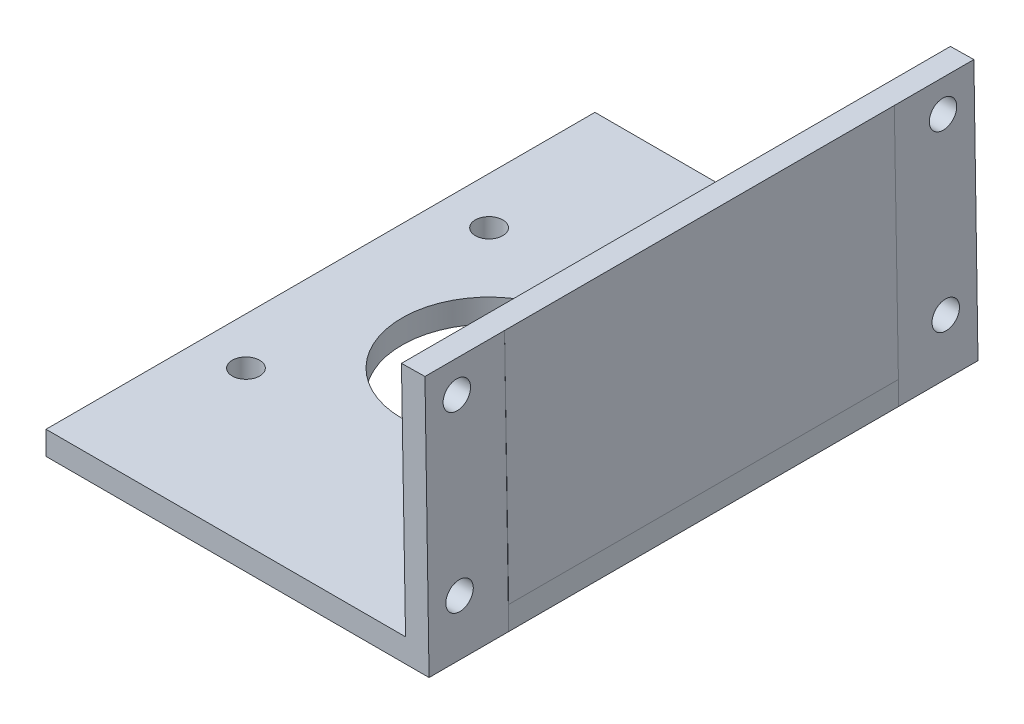
ISO-10303-21;
HEADER;
FILE_DESCRIPTION(('STEP AP214'),'2;1');
FILE_NAME('part.step','',(''),(''),'','','');
FILE_SCHEMA(('AUTOMOTIVE_DESIGN { 1 0 10303 214 1 1 1 1 }'));
ENDSEC;
DATA;
#1=APPLICATION_CONTEXT('core data for automotive mechanical design processes');
#2=APPLICATION_PROTOCOL_DEFINITION('international standard','automotive_design',2000,#1);
#3=PRODUCT_CONTEXT('',#1,'mechanical');
#4=PRODUCT('Part','Part','',(#3));
#5=PRODUCT_RELATED_PRODUCT_CATEGORY('part','',(#4));
#6=PRODUCT_DEFINITION_FORMATION('','',#4);
#7=PRODUCT_DEFINITION_CONTEXT('part definition',#1,'design');
#8=PRODUCT_DEFINITION('design','',#6,#7);
#9=PRODUCT_DEFINITION_SHAPE('','',#8);
#10=(LENGTH_UNIT() NAMED_UNIT(*) SI_UNIT(.MILLI.,.METRE.));
#11=(NAMED_UNIT(*) PLANE_ANGLE_UNIT() SI_UNIT($,.RADIAN.));
#12=(NAMED_UNIT(*) SI_UNIT($,.STERADIAN.) SOLID_ANGLE_UNIT());
#13=UNCERTAINTY_MEASURE_WITH_UNIT(LENGTH_MEASURE(1.E-05),#10,'distance_accuracy_value','');
#14=(GEOMETRIC_REPRESENTATION_CONTEXT(3) GLOBAL_UNCERTAINTY_ASSIGNED_CONTEXT((#13)) GLOBAL_UNIT_ASSIGNED_CONTEXT((#10,
#11,#12)) REPRESENTATION_CONTEXT('',''));
#15=CARTESIAN_POINT('',(0.,0.,0.));
#16=DIRECTION('',(0.,0.,1.));
#17=DIRECTION('',(1.,0.,0.));
#18=AXIS2_PLACEMENT_3D('',#15,#16,#17);
#19=CARTESIAN_POINT('',(0.,3.,0.));
#20=DIRECTION('',(0.,-1.,0.));
#21=DIRECTION('',(0.,0.,-1.));
#22=AXIS2_PLACEMENT_3D('',#19,#20,#21);
#23=PLANE('',#22);
#24=CARTESIAN_POINT('',(21.5,3.,-24.85));
#25=DIRECTION('',(0.,1.,0.));
#26=DIRECTION('',(0.,0.,1.));
#27=AXIS2_PLACEMENT_3D('',#24,#25,#26);
#28=CIRCLE('',#27,11.1);
#29=CARTESIAN_POINT('',(21.5,3.,-13.75));
#30=VERTEX_POINT('',#29);
#31=EDGE_CURVE('E289',#30,#30,#28,.T.);
#32=ORIENTED_EDGE('',*,*,#31,.F.);
#33=EDGE_LOOP('',(#32));
#34=FACE_BOUND('',#33,.T.);
#35=DIRECTION('',(0.,0.,1.));
#36=VECTOR('',#35,1.);
#37=CARTESIAN_POINT('',(0.,3.,0.));
#38=LINE('',#37,#36);
#39=CARTESIAN_POINT('',(0.,3.,-59.85));
#40=VERTEX_POINT('',#39);
#41=CARTESIAN_POINT('',(0.,3.,10.15));
#42=VERTEX_POINT('',#41);
#43=EDGE_CURVE('E120',#40,#42,#38,.T.);
#44=ORIENTED_EDGE('',*,*,#43,.T.);
#45=DIRECTION('',(-1.,0.,0.));
#46=VECTOR('',#45,1.);
#47=CARTESIAN_POINT('',(0.,3.,10.15));
#48=LINE('',#47,#46);
#49=CARTESIAN_POINT('',(45.8495430158683,3.,10.15));
#50=VERTEX_POINT('',#49);
#51=EDGE_CURVE('E188',#50,#42,#48,.T.);
#52=ORIENTED_EDGE('',*,*,#51,.F.);
#53=DIRECTION('',(0.,0.,-1.));
#54=VECTOR('',#53,1.);
#55=CARTESIAN_POINT('',(45.8495430158683,3.,0.));
#56=LINE('',#55,#54);
#57=CARTESIAN_POINT('',(45.8495430158683,3.,-59.85));
#58=VERTEX_POINT('',#57);
#59=EDGE_CURVE('E146',#50,#58,#56,.T.);
#60=ORIENTED_EDGE('',*,*,#59,.T.);
#61=DIRECTION('',(-1.,0.,0.));
#62=VECTOR('',#61,1.);
#63=CARTESIAN_POINT('',(45.8495430158683,3.,-59.85));
#64=LINE('',#63,#62);
#65=EDGE_CURVE('E138',#58,#40,#64,.T.);
#66=ORIENTED_EDGE('',*,*,#65,.T.);
#67=EDGE_LOOP('',(#44,#52,#60,#66));
#68=FACE_BOUND('',#67,.T.);
#69=CARTESIAN_POINT('',(6.00000000000001,3.,-9.35));
#70=DIRECTION('',(0.,1.,0.));
#71=DIRECTION('',(0.,0.,1.));
#72=AXIS2_PLACEMENT_3D('',#69,#70,#71);
#73=CIRCLE('',#72,1.75);
#74=CARTESIAN_POINT('',(6.00000000000001,3.,-7.60000000000001));
#75=VERTEX_POINT('',#74);
#76=EDGE_CURVE('E244',#75,#75,#73,.T.);
#77=ORIENTED_EDGE('',*,*,#76,.F.);
#78=EDGE_LOOP('',(#77));
#79=FACE_BOUND('',#78,.T.);
#80=CARTESIAN_POINT('',(37.,3.,-40.35));
#81=DIRECTION('',(0.,1.,0.));
#82=DIRECTION('',(0.,0.,1.));
#83=AXIS2_PLACEMENT_3D('',#80,#81,#82);
#84=CIRCLE('',#83,1.75);
#85=CARTESIAN_POINT('',(37.,3.,-38.6));
#86=VERTEX_POINT('',#85);
#87=EDGE_CURVE('E236',#86,#86,#84,.T.);
#88=ORIENTED_EDGE('',*,*,#87,.F.);
#89=EDGE_LOOP('',(#88));
#90=FACE_BOUND('',#89,.T.);
#91=CARTESIAN_POINT('',(37.,3.,-9.35000000000001));
#92=DIRECTION('',(0.,1.,0.));
#93=DIRECTION('',(0.,0.,1.));
#94=AXIS2_PLACEMENT_3D('',#91,#92,#93);
#95=CIRCLE('',#94,1.75);
#96=CARTESIAN_POINT('',(37.,3.,-7.60000000000001));
#97=VERTEX_POINT('',#96);
#98=EDGE_CURVE('E228',#97,#97,#95,.T.);
#99=ORIENTED_EDGE('',*,*,#98,.F.);
#100=EDGE_LOOP('',(#99));
#101=FACE_BOUND('',#100,.T.);
#102=CARTESIAN_POINT('',(6.00000000000001,3.,-40.35));
#103=DIRECTION('',(0.,1.,0.));
#104=DIRECTION('',(0.,0.,1.));
#105=AXIS2_PLACEMENT_3D('',#102,#103,#104);
#106=CIRCLE('',#105,1.75);
#107=CARTESIAN_POINT('',(6.00000000000001,3.,-38.6));
#108=VERTEX_POINT('',#107);
#109=EDGE_CURVE('E220',#108,#108,#106,.T.);
#110=ORIENTED_EDGE('',*,*,#109,.F.);
#111=EDGE_LOOP('',(#110));
#112=FACE_BOUND('',#111,.T.);
#113=ADVANCED_FACE('F44',(#34,#68,#79,#90,#101,#112),#23,.F.);
#114=CARTESIAN_POINT('',(0.,0.,0.));
#115=DIRECTION('',(0.,-1.,0.));
#116=DIRECTION('',(0.,0.,-1.));
#117=AXIS2_PLACEMENT_3D('',#114,#115,#116);
#118=PLANE('',#117);
#119=CARTESIAN_POINT('',(21.5,0.,-24.85));
#120=DIRECTION('',(0.,1.,0.));
#121=DIRECTION('',(0.,0.,1.));
#122=AXIS2_PLACEMENT_3D('',#119,#120,#121);
#123=CIRCLE('',#122,11.1);
#124=CARTESIAN_POINT('',(21.5,0.,-13.75));
#125=VERTEX_POINT('',#124);
#126=EDGE_CURVE('E267',#125,#125,#123,.T.);
#127=ORIENTED_EDGE('',*,*,#126,.T.);
#128=EDGE_LOOP('',(#127));
#129=FACE_BOUND('',#128,.T.);
#130=CARTESIAN_POINT('',(37.,0.,-9.35000000000001));
#131=DIRECTION('',(0.,1.,0.));
#132=DIRECTION('',(0.,0.,1.));
#133=AXIS2_PLACEMENT_3D('',#130,#131,#132);
#134=CIRCLE('',#133,1.75);
#135=CARTESIAN_POINT('',(37.,0.,-7.60000000000001));
#136=VERTEX_POINT('',#135);
#137=EDGE_CURVE('E224',#136,#136,#134,.T.);
#138=ORIENTED_EDGE('',*,*,#137,.T.);
#139=EDGE_LOOP('',(#138));
#140=FACE_BOUND('',#139,.T.);
#141=CARTESIAN_POINT('',(6.00000000000001,0.,-9.35));
#142=DIRECTION('',(0.,1.,0.));
#143=DIRECTION('',(0.,0.,1.));
#144=AXIS2_PLACEMENT_3D('',#141,#142,#143);
#145=CIRCLE('',#144,1.75);
#146=CARTESIAN_POINT('',(6.00000000000001,0.,-7.60000000000001));
#147=VERTEX_POINT('',#146);
#148=EDGE_CURVE('E240',#147,#147,#145,.T.);
#149=ORIENTED_EDGE('',*,*,#148,.T.);
#150=EDGE_LOOP('',(#149));
#151=FACE_BOUND('',#150,.T.);
#152=DIRECTION('',(0.,0.,-1.));
#153=VECTOR('',#152,1.);
#154=CARTESIAN_POINT('',(48.85,0.,-49.7));
#155=LINE('',#154,#153);
#156=CARTESIAN_POINT('',(48.85,0.,0.));
#157=VERTEX_POINT('',#156);
#158=CARTESIAN_POINT('',(48.85,0.,-49.7));
#159=VERTEX_POINT('',#158);
#160=EDGE_CURVE('E248',#157,#159,#155,.T.);
#161=ORIENTED_EDGE('',*,*,#160,.F.);
#162=DIRECTION('',(0.,0.,-1.));
#163=VECTOR('',#162,1.);
#164=CARTESIAN_POINT('',(48.85,0.,10.15));
#165=LINE('',#164,#163);
#166=CARTESIAN_POINT('',(48.85,0.,10.15));
#167=VERTEX_POINT('',#166);
#168=EDGE_CURVE('E62',#167,#157,#165,.T.);
#169=ORIENTED_EDGE('',*,*,#168,.F.);
#170=DIRECTION('',(1.,0.,0.));
#171=VECTOR('',#170,1.);
#172=CARTESIAN_POINT('',(0.,0.,10.15));
#173=LINE('',#172,#171);
#174=CARTESIAN_POINT('',(0.,0.,10.15));
#175=VERTEX_POINT('',#174);
#176=EDGE_CURVE('E193',#175,#167,#173,.T.);
#177=ORIENTED_EDGE('',*,*,#176,.F.);
#178=DIRECTION('',(0.,0.,1.));
#179=VECTOR('',#178,1.);
#180=CARTESIAN_POINT('',(0.,0.,0.));
#181=LINE('',#180,#179);
#182=CARTESIAN_POINT('',(0.,0.,-59.85));
#183=VERTEX_POINT('',#182);
#184=EDGE_CURVE('E254',#183,#175,#181,.T.);
#185=ORIENTED_EDGE('',*,*,#184,.F.);
#186=DIRECTION('',(1.,0.,0.));
#187=VECTOR('',#186,1.);
#188=CARTESIAN_POINT('',(0.,0.,-59.85));
#189=LINE('',#188,#187);
#190=CARTESIAN_POINT('',(48.85,0.,-59.85));
#191=VERTEX_POINT('',#190);
#192=EDGE_CURVE('E142',#183,#191,#189,.T.);
#193=ORIENTED_EDGE('',*,*,#192,.T.);
#194=DIRECTION('',(0.,0.,1.));
#195=VECTOR('',#194,1.);
#196=CARTESIAN_POINT('',(48.85,0.,-59.85));
#197=LINE('',#196,#195);
#198=EDGE_CURVE('E169',#191,#159,#197,.T.);
#199=ORIENTED_EDGE('',*,*,#198,.T.);
#200=EDGE_LOOP('',(#161,#169,#177,#185,#193,#199));
#201=FACE_BOUND('',#200,.T.);
#202=CARTESIAN_POINT('',(37.,0.,-40.35));
#203=DIRECTION('',(0.,1.,0.));
#204=DIRECTION('',(0.,0.,1.));
#205=AXIS2_PLACEMENT_3D('',#202,#203,#204);
#206=CIRCLE('',#205,1.75);
#207=CARTESIAN_POINT('',(37.,0.,-38.6));
#208=VERTEX_POINT('',#207);
#209=EDGE_CURVE('E232',#208,#208,#206,.T.);
#210=ORIENTED_EDGE('',*,*,#209,.T.);
#211=EDGE_LOOP('',(#210));
#212=FACE_BOUND('',#211,.T.);
#213=CARTESIAN_POINT('',(6.00000000000001,0.,-40.35));
#214=DIRECTION('',(0.,1.,0.));
#215=DIRECTION('',(0.,0.,1.));
#216=AXIS2_PLACEMENT_3D('',#213,#214,#215);
#217=CIRCLE('',#216,1.75);
#218=CARTESIAN_POINT('',(6.00000000000001,0.,-38.6));
#219=VERTEX_POINT('',#218);
#220=EDGE_CURVE('E219',#219,#219,#217,.T.);
#221=ORIENTED_EDGE('',*,*,#220,.T.);
#222=EDGE_LOOP('',(#221));
#223=FACE_BOUND('',#222,.T.);
#224=ADVANCED_FACE('F297',(#129,#140,#151,#201,#212,#223),#118,.T.);
#225=CARTESIAN_POINT('',(44.85,3.,0.));
#226=DIRECTION('',(0.,0.,-1.));
#227=DIRECTION('',(-1.,0.,0.));
#228=AXIS2_PLACEMENT_3D('',#225,#226,#227);
#229=PLANE('',#228);
#230=DIRECTION('',(0.0174524064372836,-0.999847695156391,0.));
#231=VECTOR('',#230,1.);
#232=CARTESIAN_POINT('',(48.3264278068815,32.9954308546917,0.));
#233=LINE('',#232,#231);
#234=CARTESIAN_POINT('',(48.3264278068815,32.9954308546917,0.));
#235=VERTEX_POINT('',#234);
#236=CARTESIAN_POINT('',(48.85,3.,0.));
#237=VERTEX_POINT('',#236);
#238=EDGE_CURVE('E210',#235,#237,#233,.T.);
#239=ORIENTED_EDGE('',*,*,#238,.F.);
#240=DIRECTION('',(0.0158660237436027,-0.999874126723243,0.));
#241=VECTOR('',#240,1.);
#242=CARTESIAN_POINT('',(48.8377029548442,0.774957701129764,0.));
#243=LINE('',#242,#241);
#244=EDGE_CURVE('E174',#235,#157,#243,.T.);
#245=ORIENTED_EDGE('',*,*,#244,.T.);
#246=DIRECTION('',(0.,-1.,0.));
#247=VECTOR('',#246,1.);
#248=CARTESIAN_POINT('',(48.85,3.,0.));
#249=LINE('',#248,#247);
#250=EDGE_CURVE('E11',#237,#157,#249,.T.);
#251=ORIENTED_EDGE('',*,*,#250,.F.);
#252=EDGE_LOOP('',(#239,#245,#251));
#253=FACE_BOUND('',#252,.T.);
#254=ADVANCED_FACE('F46',(#253),#229,.F.);
#255=CARTESIAN_POINT('',(48.85,3.,-49.7));
#256=DIRECTION('',(-1.,0.,0.));
#257=DIRECTION('',(0.,0.,1.));
#258=AXIS2_PLACEMENT_3D('',#255,#256,#257);
#259=PLANE('',#258);
#260=ORIENTED_EDGE('',*,*,#160,.T.);
#261=DIRECTION('',(0.,-1.,0.));
#262=VECTOR('',#261,1.);
#263=CARTESIAN_POINT('',(48.85,3.,-49.7));
#264=LINE('',#263,#262);
#265=CARTESIAN_POINT('',(48.85,3.,-49.7));
#266=VERTEX_POINT('',#265);
#267=EDGE_CURVE('E54',#266,#159,#264,.T.);
#268=ORIENTED_EDGE('',*,*,#267,.F.);
#269=DIRECTION('',(0.,0.,-1.));
#270=VECTOR('',#269,1.);
#271=CARTESIAN_POINT('',(48.85,3.,-49.7));
#272=LINE('',#271,#270);
#273=EDGE_CURVE('E131',#237,#266,#272,.T.);
#274=ORIENTED_EDGE('',*,*,#273,.F.);
#275=ORIENTED_EDGE('',*,*,#250,.T.);
#276=EDGE_LOOP('',(#260,#268,#274,#275));
#277=FACE_BOUND('',#276,.T.);
#278=ADVANCED_FACE('F321',(#277),#259,.F.);
#279=CARTESIAN_POINT('',(0.,3.,-49.7));
#280=DIRECTION('',(0.,0.,1.));
#281=DIRECTION('',(1.,0.,0.));
#282=AXIS2_PLACEMENT_3D('',#279,#280,#281);
#283=PLANE('',#282);
#284=ORIENTED_EDGE('',*,*,#267,.T.);
#285=DIRECTION('',(-0.0158660237436027,0.999874126723243,0.));
#286=VECTOR('',#285,1.);
#287=CARTESIAN_POINT('',(48.85,0.,-49.7));
#288=LINE('',#287,#286);
#289=CARTESIAN_POINT('',(48.3264278068815,32.9954308546917,-49.7));
#290=VERTEX_POINT('',#289);
#291=EDGE_CURVE('E148',#159,#290,#288,.T.);
#292=ORIENTED_EDGE('',*,*,#291,.T.);
#293=DIRECTION('',(0.0174524064372836,-0.999847695156391,0.));
#294=VECTOR('',#293,1.);
#295=CARTESIAN_POINT('',(48.3264278068815,32.9954308546917,-49.7));
#296=LINE('',#295,#294);
#297=EDGE_CURVE('E214',#290,#266,#296,.T.);
#298=ORIENTED_EDGE('',*,*,#297,.T.);
#299=EDGE_LOOP('',(#284,#292,#298));
#300=FACE_BOUND('',#299,.T.);
#301=ADVANCED_FACE('F319',(#300),#283,.F.);
#302=CARTESIAN_POINT('',(0.,3.,0.));
#303=DIRECTION('',(1.,0.,0.));
#304=DIRECTION('',(0.,0.,-1.));
#305=AXIS2_PLACEMENT_3D('',#302,#303,#304);
#306=PLANE('',#305);
#307=ORIENTED_EDGE('',*,*,#184,.T.);
#308=DIRECTION('',(0.,-1.,0.));
#309=VECTOR('',#308,1.);
#310=CARTESIAN_POINT('',(0.,0.,10.15));
#311=LINE('',#310,#309);
#312=EDGE_CURVE('E125',#42,#175,#311,.T.);
#313=ORIENTED_EDGE('',*,*,#312,.F.);
#314=ORIENTED_EDGE('',*,*,#43,.F.);
#315=DIRECTION('',(0.,-1.,0.));
#316=VECTOR('',#315,1.);
#317=CARTESIAN_POINT('',(0.,3.,-59.85));
#318=LINE('',#317,#316);
#319=EDGE_CURVE('E123',#40,#183,#318,.T.);
#320=ORIENTED_EDGE('',*,*,#319,.T.);
#321=EDGE_LOOP('',(#307,#313,#314,#320));
#322=FACE_BOUND('',#321,.T.);
#323=ADVANCED_FACE('F122',(#322),#306,.F.);
#324=CARTESIAN_POINT('',(6.00000000000001,3.,-9.35));
#325=DIRECTION('',(0.,-1.,0.));
#326=DIRECTION('',(0.,0.,-1.));
#327=AXIS2_PLACEMENT_3D('',#324,#325,#326);
#328=CYLINDRICAL_SURFACE('',#327,1.75);
#329=ORIENTED_EDGE('',*,*,#76,.T.);
#330=EDGE_LOOP('',(#329));
#331=FACE_BOUND('',#330,.T.);
#332=ORIENTED_EDGE('',*,*,#148,.F.);
#333=EDGE_LOOP('',(#332));
#334=FACE_BOUND('',#333,.T.);
#335=ADVANCED_FACE('F314',(#331,#334),#328,.F.);
#336=CARTESIAN_POINT('',(37.,3.,-40.35));
#337=DIRECTION('',(0.,-1.,0.));
#338=DIRECTION('',(0.,0.,-1.));
#339=AXIS2_PLACEMENT_3D('',#336,#337,#338);
#340=CYLINDRICAL_SURFACE('',#339,1.75);
#341=ORIENTED_EDGE('',*,*,#87,.T.);
#342=EDGE_LOOP('',(#341));
#343=FACE_BOUND('',#342,.T.);
#344=ORIENTED_EDGE('',*,*,#209,.F.);
#345=EDGE_LOOP('',(#344));
#346=FACE_BOUND('',#345,.T.);
#347=ADVANCED_FACE('F363',(#343,#346),#340,.F.);
#348=CARTESIAN_POINT('',(37.,3.,-9.35000000000001));
#349=DIRECTION('',(0.,-1.,0.));
#350=DIRECTION('',(0.,0.,-1.));
#351=AXIS2_PLACEMENT_3D('',#348,#349,#350);
#352=CYLINDRICAL_SURFACE('',#351,1.75);
#353=ORIENTED_EDGE('',*,*,#98,.T.);
#354=EDGE_LOOP('',(#353));
#355=FACE_BOUND('',#354,.T.);
#356=ORIENTED_EDGE('',*,*,#137,.F.);
#357=EDGE_LOOP('',(#356));
#358=FACE_BOUND('',#357,.T.);
#359=ADVANCED_FACE('F354',(#355,#358),#352,.F.);
#360=CARTESIAN_POINT('',(6.00000000000001,3.,-40.35));
#361=DIRECTION('',(0.,-1.,0.));
#362=DIRECTION('',(0.,0.,-1.));
#363=AXIS2_PLACEMENT_3D('',#360,#361,#362);
#364=CYLINDRICAL_SURFACE('',#363,1.75);
#365=ORIENTED_EDGE('',*,*,#109,.T.);
#366=EDGE_LOOP('',(#365));
#367=FACE_BOUND('',#366,.T.);
#368=ORIENTED_EDGE('',*,*,#220,.F.);
#369=EDGE_LOOP('',(#368));
#370=FACE_BOUND('',#369,.T.);
#371=ADVANCED_FACE('F351',(#367,#370),#364,.F.);
#372=CARTESIAN_POINT('',(45.3268847214123,32.9430736353799,0.));
#373=DIRECTION('',(0.999847695156391,0.0174524064372836,0.));
#374=DIRECTION('',(-0.0174524064372836,0.999847695156391,0.));
#375=AXIS2_PLACEMENT_3D('',#372,#373,#374);
#376=PLANE('',#375);
#377=CARTESIAN_POINT('',(45.7806472887817,6.94703356131372,6.15));
#378=DIRECTION('',(0.999847695156391,0.0174524064372836,0.));
#379=DIRECTION('',(-0.0174524064372836,0.999847695156391,0.));
#380=AXIS2_PLACEMENT_3D('',#377,#378,#379);
#381=CIRCLE('',#380,1.75);
#382=CARTESIAN_POINT('',(45.7501055775164,8.6967670278374,6.15));
#383=VERTEX_POINT('',#382);
#384=EDGE_CURVE('E152',#383,#383,#381,.T.);
#385=ORIENTED_EDGE('',*,*,#384,.T.);
#386=EDGE_LOOP('',(#385));
#387=FACE_BOUND('',#386,.T.);
#388=CARTESIAN_POINT('',(45.3966943471614,28.9436828547543,-55.85));
#389=DIRECTION('',(0.999847695156391,0.0174524064372836,0.));
#390=DIRECTION('',(-0.0174524064372836,0.999847695156391,0.));
#391=AXIS2_PLACEMENT_3D('',#388,#389,#390);
#392=CIRCLE('',#391,1.75);
#393=CARTESIAN_POINT('',(45.3661526358962,30.693416321278,-55.85));
#394=VERTEX_POINT('',#393);
#395=EDGE_CURVE('E271',#394,#394,#392,.T.);
#396=ORIENTED_EDGE('',*,*,#395,.T.);
#397=EDGE_LOOP('',(#396));
#398=FACE_BOUND('',#397,.T.);
#399=CARTESIAN_POINT('',(45.7806472887817,6.94703356131372,-55.85));
#400=DIRECTION('',(0.999847695156391,0.0174524064372836,0.));
#401=DIRECTION('',(-0.0174524064372836,0.999847695156391,0.));
#402=AXIS2_PLACEMENT_3D('',#399,#400,#401);
#403=CIRCLE('',#402,1.75);
#404=CARTESIAN_POINT('',(45.7501055775164,8.6967670278374,-55.85));
#405=VERTEX_POINT('',#404);
#406=EDGE_CURVE('E266',#405,#405,#403,.T.);
#407=ORIENTED_EDGE('',*,*,#406,.T.);
#408=EDGE_LOOP('',(#407));
#409=FACE_BOUND('',#408,.T.);
#410=CARTESIAN_POINT('',(45.3966943471614,28.9436828547543,6.15));
#411=DIRECTION('',(0.999847695156391,0.0174524064372836,0.));
#412=DIRECTION('',(-0.0174524064372836,0.999847695156391,0.));
#413=AXIS2_PLACEMENT_3D('',#410,#411,#412);
#414=CIRCLE('',#413,1.75);
#415=CARTESIAN_POINT('',(45.3661526358962,30.693416321278,6.15));
#416=VERTEX_POINT('',#415);
#417=EDGE_CURVE('E275',#416,#416,#414,.T.);
#418=ORIENTED_EDGE('',*,*,#417,.T.);
#419=EDGE_LOOP('',(#418));
#420=FACE_BOUND('',#419,.T.);
#421=DIRECTION('',(0.,0.,1.));
#422=VECTOR('',#421,1.);
#423=CARTESIAN_POINT('',(45.3268847214123,32.9430736353799,0.));
#424=LINE('',#423,#422);
#425=CARTESIAN_POINT('',(45.3268847214123,32.9430736353799,-59.85));
#426=VERTEX_POINT('',#425);
#427=CARTESIAN_POINT('',(45.3268847214123,32.9430736353799,10.15));
#428=VERTEX_POINT('',#427);
#429=EDGE_CURVE('E207',#426,#428,#424,.T.);
#430=ORIENTED_EDGE('',*,*,#429,.F.);
#431=DIRECTION('',(0.0174524064372832,-0.999847695156391,0.));
#432=VECTOR('',#431,1.);
#433=CARTESIAN_POINT('',(45.3268847214123,32.9430736353799,-59.85));
#434=LINE('',#433,#432);
#435=EDGE_CURVE('E167',#426,#58,#434,.T.);
#436=ORIENTED_EDGE('',*,*,#435,.T.);
#437=ORIENTED_EDGE('',*,*,#59,.F.);
#438=DIRECTION('',(0.0174524064372836,-0.999847695156391,0.));
#439=VECTOR('',#438,1.);
#440=CARTESIAN_POINT('',(45.887927109526,0.800976747118096,10.15));
#441=LINE('',#440,#439);
#442=EDGE_CURVE('E184',#428,#50,#441,.T.);
#443=ORIENTED_EDGE('',*,*,#442,.F.);
#444=EDGE_LOOP('',(#430,#436,#437,#443));
#445=FACE_BOUND('',#444,.T.);
#446=ADVANCED_FACE('F353',(#387,#398,#409,#420,#445),#376,.F.);
#447=CARTESIAN_POINT('',(48.3264278068815,32.9954308546917,-49.7));
#448=DIRECTION('',(-0.999847695156391,-0.0174524064372836,0.));
#449=DIRECTION('',(0.0174524064372836,-0.999847695156391,0.));
#450=AXIS2_PLACEMENT_3D('',#447,#448,#449);
#451=PLANE('',#450);
#452=ORIENTED_EDGE('',*,*,#273,.T.);
#453=ORIENTED_EDGE('',*,*,#297,.F.);
#454=DIRECTION('',(0.,0.,-1.));
#455=VECTOR('',#454,1.);
#456=CARTESIAN_POINT('',(48.3264278068815,32.9954308546917,-49.7));
#457=LINE('',#456,#455);
#458=EDGE_CURVE('E203',#235,#290,#457,.T.);
#459=ORIENTED_EDGE('',*,*,#458,.F.);
#460=ORIENTED_EDGE('',*,*,#238,.T.);
#461=EDGE_LOOP('',(#452,#453,#459,#460));
#462=FACE_BOUND('',#461,.T.);
#463=ADVANCED_FACE('F335',(#462),#451,.F.);
#464=CARTESIAN_POINT('',(-0.561042388113673,32.1420968882618,0.));
#465=DIRECTION('',(0.0174524064372837,-0.999847695156391,0.));
#466=DIRECTION('',(0.999847695156391,0.0174524064372837,0.));
#467=AXIS2_PLACEMENT_3D('',#464,#465,#466);
#468=PLANE('',#467);
#469=ORIENTED_EDGE('',*,*,#458,.T.);
#470=DIRECTION('',(0.,0.,1.));
#471=VECTOR('',#470,1.);
#472=CARTESIAN_POINT('',(48.3264278068815,32.9954308546917,-59.85));
#473=LINE('',#472,#471);
#474=CARTESIAN_POINT('',(48.3264278068815,32.9954308546917,-59.85));
#475=VERTEX_POINT('',#474);
#476=EDGE_CURVE('E171',#475,#290,#473,.T.);
#477=ORIENTED_EDGE('',*,*,#476,.F.);
#478=DIRECTION('',(-0.999847695156391,-0.0174524064372831,0.));
#479=VECTOR('',#478,1.);
#480=CARTESIAN_POINT('',(48.3264278068815,32.9954308546917,-59.85));
#481=LINE('',#480,#479);
#482=EDGE_CURVE('E163',#475,#426,#481,.T.);
#483=ORIENTED_EDGE('',*,*,#482,.T.);
#484=ORIENTED_EDGE('',*,*,#429,.T.);
#485=DIRECTION('',(-0.999847695156391,-0.0174524064372837,0.));
#486=VECTOR('',#485,1.);
#487=CARTESIAN_POINT('',(-0.561042388113675,32.1420968882618,10.15));
#488=LINE('',#487,#486);
#489=CARTESIAN_POINT('',(48.3264278068815,32.9954308546917,10.15));
#490=VERTEX_POINT('',#489);
#491=EDGE_CURVE('E180',#490,#428,#488,.T.);
#492=ORIENTED_EDGE('',*,*,#491,.F.);
#493=DIRECTION('',(0.,0.,-1.));
#494=VECTOR('',#493,1.);
#495=CARTESIAN_POINT('',(48.3264278068815,32.9954308546917,10.15));
#496=LINE('',#495,#494);
#497=EDGE_CURVE('E200',#490,#235,#496,.T.);
#498=ORIENTED_EDGE('',*,*,#497,.T.);
#499=EDGE_LOOP('',(#469,#477,#483,#484,#492,#498));
#500=FACE_BOUND('',#499,.T.);
#501=ADVANCED_FACE('F341',(#500),#468,.F.);
#502=CARTESIAN_POINT('',(48.8377029548442,0.774957701129764,10.15));
#503=DIRECTION('',(0.999874126723243,0.0158660237436027,0.));
#504=DIRECTION('',(-0.0158660237436027,0.999874126723243,0.));
#505=AXIS2_PLACEMENT_3D('',#502,#503,#504);
#506=PLANE('',#505);
#507=CARTESIAN_POINT('',(48.7389449434316,6.99867083895262,6.15));
#508=DIRECTION('',(0.999874126723243,0.0158660237436027,0.));
#509=DIRECTION('',(-0.0158660237436027,0.999874126723243,0.));
#510=AXIS2_PLACEMENT_3D('',#507,#508,#509);
#511=ELLIPSE('',#510,1.75000220264787,1.75);
#512=CARTESIAN_POINT('',(48.7111793669331,8.74845276308891,6.15));
#513=VERTEX_POINT('',#512);
#514=EDGE_CURVE('E48',#513,#513,#511,.T.);
#515=ORIENTED_EDGE('',*,*,#514,.F.);
#516=EDGE_LOOP('',(#515));
#517=FACE_BOUND('',#516,.T.);
#518=CARTESIAN_POINT('',(48.3898919817354,28.9959293138088,6.15));
#519=DIRECTION('',(0.999874126723243,0.0158660237436027,0.));
#520=DIRECTION('',(-0.0158660237436027,0.999874126723243,0.));
#521=AXIS2_PLACEMENT_3D('',#518,#519,#520);
#522=ELLIPSE('',#521,1.75000220264787,1.75);
#523=CARTESIAN_POINT('',(48.3621264052368,30.7457112379451,6.15));
#524=VERTEX_POINT('',#523);
#525=EDGE_CURVE('E272',#524,#524,#522,.T.);
#526=ORIENTED_EDGE('',*,*,#525,.F.);
#527=EDGE_LOOP('',(#526));
#528=FACE_BOUND('',#527,.T.);
#529=ORIENTED_EDGE('',*,*,#244,.F.);
#530=ORIENTED_EDGE('',*,*,#497,.F.);
#531=DIRECTION('',(0.0158660237436027,-0.999874126723243,0.));
#532=VECTOR('',#531,1.);
#533=CARTESIAN_POINT('',(48.8377029548442,0.774957701129764,10.15));
#534=LINE('',#533,#532);
#535=EDGE_CURVE('E177',#490,#167,#534,.T.);
#536=ORIENTED_EDGE('',*,*,#535,.T.);
#537=ORIENTED_EDGE('',*,*,#168,.T.);
#538=EDGE_LOOP('',(#529,#530,#536,#537));
#539=FACE_BOUND('',#538,.T.);
#540=ADVANCED_FACE('F337',(#517,#528,#539),#506,.T.);
#541=CARTESIAN_POINT('',(0.,0.,10.15));
#542=DIRECTION('',(0.,0.,1.));
#543=DIRECTION('',(1.,0.,0.));
#544=AXIS2_PLACEMENT_3D('',#541,#542,#543);
#545=PLANE('',#544);
#546=ORIENTED_EDGE('',*,*,#535,.F.);
#547=ORIENTED_EDGE('',*,*,#491,.T.);
#548=ORIENTED_EDGE('',*,*,#442,.T.);
#549=ORIENTED_EDGE('',*,*,#51,.T.);
#550=ORIENTED_EDGE('',*,*,#312,.T.);
#551=ORIENTED_EDGE('',*,*,#176,.T.);
#552=EDGE_LOOP('',(#546,#547,#548,#549,#550,#551));
#553=FACE_BOUND('',#552,.T.);
#554=ADVANCED_FACE('F344',(#553),#545,.T.);
#555=CARTESIAN_POINT('',(48.85,0.,-59.85));
#556=DIRECTION('',(0.999874126723243,0.0158660237436027,0.));
#557=DIRECTION('',(-0.0158660237436027,0.999874126723243,0.));
#558=AXIS2_PLACEMENT_3D('',#555,#556,#557);
#559=PLANE('',#558);
#560=CARTESIAN_POINT('',(48.3898919817354,28.9959293138088,-55.85));
#561=DIRECTION('',(0.999874126723243,0.0158660237436027,0.));
#562=DIRECTION('',(-0.0158660237436027,0.999874126723243,0.));
#563=AXIS2_PLACEMENT_3D('',#560,#561,#562);
#564=ELLIPSE('',#563,1.75000220264787,1.75);
#565=CARTESIAN_POINT('',(48.3621264052368,30.7457112379451,-55.85));
#566=VERTEX_POINT('',#565);
#567=EDGE_CURVE('E268',#566,#566,#564,.T.);
#568=ORIENTED_EDGE('',*,*,#567,.F.);
#569=EDGE_LOOP('',(#568));
#570=FACE_BOUND('',#569,.T.);
#571=CARTESIAN_POINT('',(48.7389449434316,6.99867083895262,-55.85));
#572=DIRECTION('',(0.999874126723243,0.0158660237436027,0.));
#573=DIRECTION('',(-0.0158660237436027,0.999874126723243,0.));
#574=AXIS2_PLACEMENT_3D('',#571,#572,#573);
#575=ELLIPSE('',#574,1.75000220264787,1.75);
#576=CARTESIAN_POINT('',(48.7111793669331,8.74845276308892,-55.85));
#577=VERTEX_POINT('',#576);
#578=EDGE_CURVE('E262',#577,#577,#575,.T.);
#579=ORIENTED_EDGE('',*,*,#578,.F.);
#580=EDGE_LOOP('',(#579));
#581=FACE_BOUND('',#580,.T.);
#582=ORIENTED_EDGE('',*,*,#291,.F.);
#583=ORIENTED_EDGE('',*,*,#198,.F.);
#584=DIRECTION('',(-0.0158660237436027,0.999874126723243,0.));
#585=VECTOR('',#584,1.);
#586=CARTESIAN_POINT('',(48.85,0.,-59.85));
#587=LINE('',#586,#585);
#588=EDGE_CURVE('E159',#191,#475,#587,.T.);
#589=ORIENTED_EDGE('',*,*,#588,.T.);
#590=ORIENTED_EDGE('',*,*,#476,.T.);
#591=EDGE_LOOP('',(#582,#583,#589,#590));
#592=FACE_BOUND('',#591,.T.);
#593=ADVANCED_FACE('F416',(#570,#581,#592),#559,.T.);
#594=CARTESIAN_POINT('',(0.,0.,-59.85));
#595=DIRECTION('',(0.,0.,1.));
#596=DIRECTION('',(1.,0.,0.));
#597=AXIS2_PLACEMENT_3D('',#594,#595,#596);
#598=PLANE('',#597);
#599=ORIENTED_EDGE('',*,*,#65,.F.);
#600=ORIENTED_EDGE('',*,*,#435,.F.);
#601=ORIENTED_EDGE('',*,*,#482,.F.);
#602=ORIENTED_EDGE('',*,*,#588,.F.);
#603=ORIENTED_EDGE('',*,*,#192,.F.);
#604=ORIENTED_EDGE('',*,*,#319,.F.);
#605=EDGE_LOOP('',(#599,#600,#601,#602,#603,#604));
#606=FACE_BOUND('',#605,.T.);
#607=ADVANCED_FACE('F136',(#606),#598,.F.);
#608=CARTESIAN_POINT('',(-0.107279820744301,6.14605681419562,-55.85));
#609=DIRECTION('',(0.999847695156391,0.0174524064372836,0.));
#610=DIRECTION('',(-0.0174524064372836,0.999847695156391,0.));
#611=AXIS2_PLACEMENT_3D('',#608,#609,#610);
#612=CYLINDRICAL_SURFACE('',#611,1.75);
#613=ORIENTED_EDGE('',*,*,#578,.T.);
#614=EDGE_LOOP('',(#613));
#615=FACE_BOUND('',#614,.T.);
#616=ORIENTED_EDGE('',*,*,#406,.F.);
#617=EDGE_LOOP('',(#616));
#618=FACE_BOUND('',#617,.T.);
#619=ADVANCED_FACE('F566',(#615,#618),#612,.F.);
#620=CARTESIAN_POINT('',(-0.491232762364541,28.1427061076362,-55.85));
#621=DIRECTION('',(0.999847695156391,0.0174524064372836,0.));
#622=DIRECTION('',(-0.0174524064372836,0.999847695156391,0.));
#623=AXIS2_PLACEMENT_3D('',#620,#621,#622);
#624=CYLINDRICAL_SURFACE('',#623,1.75);
#625=ORIENTED_EDGE('',*,*,#567,.T.);
#626=EDGE_LOOP('',(#625));
#627=FACE_BOUND('',#626,.T.);
#628=ORIENTED_EDGE('',*,*,#395,.F.);
#629=EDGE_LOOP('',(#628));
#630=FACE_BOUND('',#629,.T.);
#631=ADVANCED_FACE('F575',(#627,#630),#624,.F.);
#632=CARTESIAN_POINT('',(-0.491232762364541,28.1427061076362,6.15));
#633=DIRECTION('',(0.999847695156391,0.0174524064372836,0.));
#634=DIRECTION('',(-0.0174524064372836,0.999847695156391,0.));
#635=AXIS2_PLACEMENT_3D('',#632,#633,#634);
#636=CYLINDRICAL_SURFACE('',#635,1.75);
#637=ORIENTED_EDGE('',*,*,#525,.T.);
#638=EDGE_LOOP('',(#637));
#639=FACE_BOUND('',#638,.T.);
#640=ORIENTED_EDGE('',*,*,#417,.F.);
#641=EDGE_LOOP('',(#640));
#642=FACE_BOUND('',#641,.T.);
#643=ADVANCED_FACE('F586',(#639,#642),#636,.F.);
#644=CARTESIAN_POINT('',(-0.107279820744301,6.14605681419562,6.15));
#645=DIRECTION('',(0.999847695156391,0.0174524064372836,0.));
#646=DIRECTION('',(-0.0174524064372836,0.999847695156391,0.));
#647=AXIS2_PLACEMENT_3D('',#644,#645,#646);
#648=CYLINDRICAL_SURFACE('',#647,1.75);
#649=ORIENTED_EDGE('',*,*,#514,.T.);
#650=EDGE_LOOP('',(#649));
#651=FACE_BOUND('',#650,.T.);
#652=ORIENTED_EDGE('',*,*,#384,.F.);
#653=EDGE_LOOP('',(#652));
#654=FACE_BOUND('',#653,.T.);
#655=ADVANCED_FACE('F303',(#651,#654),#648,.F.);
#656=CARTESIAN_POINT('',(21.5,0.,-24.85));
#657=DIRECTION('',(0.,1.,0.));
#658=DIRECTION('',(0.,0.,1.));
#659=AXIS2_PLACEMENT_3D('',#656,#657,#658);
#660=CYLINDRICAL_SURFACE('',#659,11.1);
#661=ORIENTED_EDGE('',*,*,#126,.F.);
#662=EDGE_LOOP('',(#661));
#663=FACE_BOUND('',#662,.T.);
#664=ORIENTED_EDGE('',*,*,#31,.T.);
#665=EDGE_LOOP('',(#664));
#666=FACE_BOUND('',#665,.T.);
#667=ADVANCED_FACE('F300',(#663,#666),#660,.F.);
#668=CLOSED_SHELL('',(#113,#224,#254,#278,#301,#323,#335,#347,#359,#371,#446,#463,#501,#540,
#554,#593,#607,#619,#631,#643,#655,#667));
#669=MANIFOLD_SOLID_BREP('B2',#668);
#670=ADVANCED_BREP_SHAPE_REPRESENTATION('',(#18,#669),#14);
#671=SHAPE_DEFINITION_REPRESENTATION(#9,#670);
ENDSEC;
END-ISO-10303-21;
